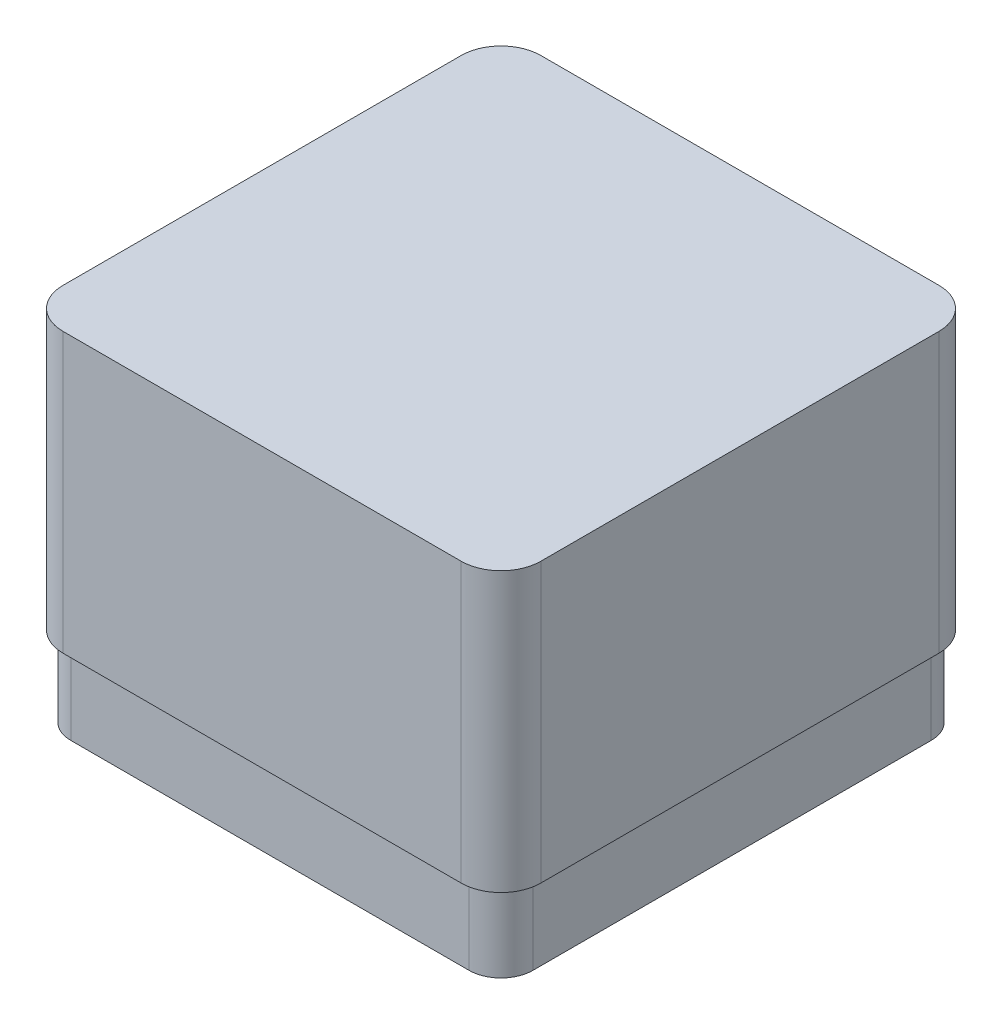
ISO-10303-21;
HEADER;
FILE_DESCRIPTION(('STEP AP214'),'2;1');
FILE_NAME('part.step','',(''),(''),'','','');
FILE_SCHEMA(('AUTOMOTIVE_DESIGN { 1 0 10303 214 1 1 1 1 }'));
ENDSEC;
DATA;
#1=APPLICATION_CONTEXT('core data for automotive mechanical design processes');
#2=APPLICATION_PROTOCOL_DEFINITION('international standard','automotive_design',2000,#1);
#3=PRODUCT_CONTEXT('',#1,'mechanical');
#4=PRODUCT('Part','Part','',(#3));
#5=PRODUCT_RELATED_PRODUCT_CATEGORY('part','',(#4));
#6=PRODUCT_DEFINITION_FORMATION('','',#4);
#7=PRODUCT_DEFINITION_CONTEXT('part definition',#1,'design');
#8=PRODUCT_DEFINITION('design','',#6,#7);
#9=PRODUCT_DEFINITION_SHAPE('','',#8);
#10=(LENGTH_UNIT() NAMED_UNIT(*) SI_UNIT(.MILLI.,.METRE.));
#11=(NAMED_UNIT(*) PLANE_ANGLE_UNIT() SI_UNIT($,.RADIAN.));
#12=(NAMED_UNIT(*) SI_UNIT($,.STERADIAN.) SOLID_ANGLE_UNIT());
#13=UNCERTAINTY_MEASURE_WITH_UNIT(LENGTH_MEASURE(1.E-05),#10,'distance_accuracy_value','');
#14=(GEOMETRIC_REPRESENTATION_CONTEXT(3) GLOBAL_UNCERTAINTY_ASSIGNED_CONTEXT((#13)) GLOBAL_UNIT_ASSIGNED_CONTEXT((#10,
#11,#12)) REPRESENTATION_CONTEXT('',''));
#15=CARTESIAN_POINT('',(0.,0.,0.));
#16=DIRECTION('',(0.,0.,1.));
#17=DIRECTION('',(1.,0.,0.));
#18=AXIS2_PLACEMENT_3D('',#15,#16,#17);
#19=CARTESIAN_POINT('',(0.,0.,0.));
#20=DIRECTION('',(0.,-1.,0.));
#21=DIRECTION('',(0.,0.,-1.));
#22=AXIS2_PLACEMENT_3D('',#19,#20,#21);
#23=PLANE('',#22);
#24=CARTESIAN_POINT('',(110.,0.,-10.));
#25=DIRECTION('',(0.,-1.,0.));
#26=DIRECTION('',(0.,0.,-1.));
#27=AXIS2_PLACEMENT_3D('',#24,#25,#26);
#28=CIRCLE('',#27,6.);
#29=CARTESIAN_POINT('',(116.,0.,-10.));
#30=VERTEX_POINT('',#29);
#31=CARTESIAN_POINT('',(110.,0.,-4.));
#32=VERTEX_POINT('',#31);
#33=EDGE_CURVE('E315',#30,#32,#28,.T.);
#34=ORIENTED_EDGE('',*,*,#33,.F.);
#35=DIRECTION('',(0.,0.,-1.));
#36=VECTOR('',#35,1.);
#37=CARTESIAN_POINT('',(116.,0.,0.));
#38=LINE('',#37,#36);
#39=CARTESIAN_POINT('',(116.,0.,-110.));
#40=VERTEX_POINT('',#39);
#41=EDGE_CURVE('E333',#30,#40,#38,.T.);
#42=ORIENTED_EDGE('',*,*,#41,.T.);
#43=CARTESIAN_POINT('',(110.,0.,-110.));
#44=DIRECTION('',(0.,-1.,0.));
#45=DIRECTION('',(0.,0.,-1.));
#46=AXIS2_PLACEMENT_3D('',#43,#44,#45);
#47=CIRCLE('',#46,6.);
#48=CARTESIAN_POINT('',(110.,0.,-116.));
#49=VERTEX_POINT('',#48);
#50=EDGE_CURVE('E318',#49,#40,#47,.T.);
#51=ORIENTED_EDGE('',*,*,#50,.F.);
#52=DIRECTION('',(-1.,0.,0.));
#53=VECTOR('',#52,1.);
#54=CARTESIAN_POINT('',(0.,0.,-116.));
#55=LINE('',#54,#53);
#56=CARTESIAN_POINT('',(9.99999999999997,0.,-116.));
#57=VERTEX_POINT('',#56);
#58=EDGE_CURVE('E292',#49,#57,#55,.T.);
#59=ORIENTED_EDGE('',*,*,#58,.T.);
#60=CARTESIAN_POINT('',(9.99999999999997,0.,-110.));
#61=DIRECTION('',(0.,-1.,0.));
#62=DIRECTION('',(0.,0.,-1.));
#63=AXIS2_PLACEMENT_3D('',#60,#61,#62);
#64=CIRCLE('',#63,6.);
#65=CARTESIAN_POINT('',(3.99999999999997,0.,-110.));
#66=VERTEX_POINT('',#65);
#67=EDGE_CURVE('E328',#66,#57,#64,.T.);
#68=ORIENTED_EDGE('',*,*,#67,.F.);
#69=DIRECTION('',(0.,0.,1.));
#70=VECTOR('',#69,1.);
#71=CARTESIAN_POINT('',(4.,0.,0.));
#72=LINE('',#71,#70);
#73=CARTESIAN_POINT('',(4.,0.,-10.));
#74=VERTEX_POINT('',#73);
#75=EDGE_CURVE('E283',#66,#74,#72,.T.);
#76=ORIENTED_EDGE('',*,*,#75,.T.);
#77=CARTESIAN_POINT('',(9.99999999999999,0.,-10.));
#78=DIRECTION('',(0.,-1.,0.));
#79=DIRECTION('',(0.,0.,-1.));
#80=AXIS2_PLACEMENT_3D('',#77,#78,#79);
#81=CIRCLE('',#80,6.);
#82=CARTESIAN_POINT('',(9.99999999999999,0.,-4.));
#83=VERTEX_POINT('',#82);
#84=EDGE_CURVE('E330',#83,#74,#81,.T.);
#85=ORIENTED_EDGE('',*,*,#84,.F.);
#86=DIRECTION('',(1.,0.,0.));
#87=VECTOR('',#86,1.);
#88=CARTESIAN_POINT('',(0.,0.,-4.));
#89=LINE('',#88,#87);
#90=EDGE_CURVE('E327',#83,#32,#89,.T.);
#91=ORIENTED_EDGE('',*,*,#90,.T.);
#92=EDGE_LOOP('',(#34,#42,#51,#59,#68,#76,#85,#91));
#93=FACE_BOUND('',#92,.T.);
#94=DIRECTION('',(1.,0.,0.));
#95=VECTOR('',#94,1.);
#96=CARTESIAN_POINT('',(9.99999999999997,0.,-118.));
#97=LINE('',#96,#95);
#98=CARTESIAN_POINT('',(9.99999999999997,0.,-118.));
#99=VERTEX_POINT('',#98);
#100=CARTESIAN_POINT('',(110.,0.,-118.));
#101=VERTEX_POINT('',#100);
#102=EDGE_CURVE('E221',#99,#101,#97,.T.);
#103=ORIENTED_EDGE('',*,*,#102,.T.);
#104=CARTESIAN_POINT('',(110.,0.,-110.));
#105=DIRECTION('',(0.,-1.,0.));
#106=DIRECTION('',(0.,0.,-1.));
#107=AXIS2_PLACEMENT_3D('',#104,#105,#106);
#108=CIRCLE('',#107,7.99999999999999);
#109=CARTESIAN_POINT('',(118.,0.,-110.));
#110=VERTEX_POINT('',#109);
#111=EDGE_CURVE('E241',#101,#110,#108,.T.);
#112=ORIENTED_EDGE('',*,*,#111,.T.);
#113=DIRECTION('',(0.,0.,1.));
#114=VECTOR('',#113,1.);
#115=CARTESIAN_POINT('',(118.,0.,-110.));
#116=LINE('',#115,#114);
#117=CARTESIAN_POINT('',(118.,0.,-9.99999999999999));
#118=VERTEX_POINT('',#117);
#119=EDGE_CURVE('E201',#110,#118,#116,.T.);
#120=ORIENTED_EDGE('',*,*,#119,.T.);
#121=CARTESIAN_POINT('',(110.,0.,-10.));
#122=DIRECTION('',(0.,-1.,0.));
#123=DIRECTION('',(0.,0.,-1.));
#124=AXIS2_PLACEMENT_3D('',#121,#122,#123);
#125=CIRCLE('',#124,7.99999999999998);
#126=CARTESIAN_POINT('',(110.,0.,-2.00000000000002));
#127=VERTEX_POINT('',#126);
#128=EDGE_CURVE('E50',#118,#127,#125,.T.);
#129=ORIENTED_EDGE('',*,*,#128,.T.);
#130=DIRECTION('',(-1.,0.,0.));
#131=VECTOR('',#130,1.);
#132=CARTESIAN_POINT('',(110.,0.,-2.));
#133=LINE('',#132,#131);
#134=CARTESIAN_POINT('',(9.99999999999999,0.,-2.));
#135=VERTEX_POINT('',#134);
#136=EDGE_CURVE('E245',#127,#135,#133,.T.);
#137=ORIENTED_EDGE('',*,*,#136,.T.);
#138=CARTESIAN_POINT('',(9.99999999999999,0.,-10.));
#139=DIRECTION('',(0.,-1.,0.));
#140=DIRECTION('',(0.,0.,-1.));
#141=AXIS2_PLACEMENT_3D('',#138,#139,#140);
#142=CIRCLE('',#141,8.);
#143=CARTESIAN_POINT('',(2.,0.,-10.));
#144=VERTEX_POINT('',#143);
#145=EDGE_CURVE('E248',#135,#144,#142,.T.);
#146=ORIENTED_EDGE('',*,*,#145,.T.);
#147=DIRECTION('',(0.,0.,-1.));
#148=VECTOR('',#147,1.);
#149=CARTESIAN_POINT('',(2.,0.,-10.));
#150=LINE('',#149,#148);
#151=CARTESIAN_POINT('',(2.,0.,-110.));
#152=VERTEX_POINT('',#151);
#153=EDGE_CURVE('E251',#144,#152,#150,.T.);
#154=ORIENTED_EDGE('',*,*,#153,.T.);
#155=CARTESIAN_POINT('',(9.99999999999997,0.,-110.));
#156=DIRECTION('',(0.,-1.,0.));
#157=DIRECTION('',(0.,0.,-1.));
#158=AXIS2_PLACEMENT_3D('',#155,#156,#157);
#159=CIRCLE('',#158,7.99999999999998);
#160=EDGE_CURVE('E224',#152,#99,#159,.T.);
#161=ORIENTED_EDGE('',*,*,#160,.T.);
#162=EDGE_LOOP('',(#103,#112,#120,#129,#137,#146,#154,#161));
#163=FACE_BOUND('',#162,.T.);
#164=ADVANCED_FACE('F35',(#93,#163),#23,.T.);
#165=CARTESIAN_POINT('',(4.,90.,0.));
#166=DIRECTION('',(1.,0.,0.));
#167=DIRECTION('',(0.,0.,-1.));
#168=AXIS2_PLACEMENT_3D('',#165,#166,#167);
#169=PLANE('',#168);
#170=ORIENTED_EDGE('',*,*,#75,.F.);
#171=DIRECTION('',(0.,1.,0.));
#172=VECTOR('',#171,1.);
#173=CARTESIAN_POINT('',(3.99999999999997,90.,-110.));
#174=LINE('',#173,#172);
#175=CARTESIAN_POINT('',(3.99999999999997,86.,-110.));
#176=VERTEX_POINT('',#175);
#177=EDGE_CURVE('E287',#176,#66,#174,.F.);
#178=ORIENTED_EDGE('',*,*,#177,.F.);
#179=DIRECTION('',(0.,0.,1.));
#180=VECTOR('',#179,1.);
#181=CARTESIAN_POINT('',(4.,86.,0.));
#182=LINE('',#181,#180);
#183=CARTESIAN_POINT('',(4.,86.,-10.));
#184=VERTEX_POINT('',#183);
#185=EDGE_CURVE('E288',#176,#184,#182,.T.);
#186=ORIENTED_EDGE('',*,*,#185,.T.);
#187=DIRECTION('',(0.,1.,0.));
#188=VECTOR('',#187,1.);
#189=CARTESIAN_POINT('',(4.,90.,-10.));
#190=LINE('',#189,#188);
#191=EDGE_CURVE('E284',#74,#184,#190,.T.);
#192=ORIENTED_EDGE('',*,*,#191,.F.);
#193=EDGE_LOOP('',(#170,#178,#186,#192));
#194=FACE_BOUND('',#193,.T.);
#195=ADVANCED_FACE('F427',(#194),#169,.T.);
#196=CARTESIAN_POINT('',(0.,90.,-4.));
#197=DIRECTION('',(0.,0.,-1.));
#198=DIRECTION('',(-1.,0.,0.));
#199=AXIS2_PLACEMENT_3D('',#196,#197,#198);
#200=PLANE('',#199);
#201=ORIENTED_EDGE('',*,*,#90,.F.);
#202=DIRECTION('',(0.,1.,0.));
#203=VECTOR('',#202,1.);
#204=CARTESIAN_POINT('',(9.99999999999999,90.,-4.));
#205=LINE('',#204,#203);
#206=CARTESIAN_POINT('',(9.99999999999999,86.,-4.));
#207=VERTEX_POINT('',#206);
#208=EDGE_CURVE('E313',#207,#83,#205,.F.);
#209=ORIENTED_EDGE('',*,*,#208,.F.);
#210=DIRECTION('',(1.,0.,0.));
#211=VECTOR('',#210,1.);
#212=CARTESIAN_POINT('',(0.,86.,-4.));
#213=LINE('',#212,#211);
#214=CARTESIAN_POINT('',(110.,86.,-4.));
#215=VERTEX_POINT('',#214);
#216=EDGE_CURVE('E291',#207,#215,#213,.T.);
#217=ORIENTED_EDGE('',*,*,#216,.T.);
#218=DIRECTION('',(0.,1.,0.));
#219=VECTOR('',#218,1.);
#220=CARTESIAN_POINT('',(110.,90.,-4.));
#221=LINE('',#220,#219);
#222=EDGE_CURVE('E306',#32,#215,#221,.T.);
#223=ORIENTED_EDGE('',*,*,#222,.F.);
#224=EDGE_LOOP('',(#201,#209,#217,#223));
#225=FACE_BOUND('',#224,.T.);
#226=ADVANCED_FACE('F433',(#225),#200,.T.);
#227=CARTESIAN_POINT('',(116.,90.,0.));
#228=DIRECTION('',(-1.,0.,0.));
#229=DIRECTION('',(0.,0.,1.));
#230=AXIS2_PLACEMENT_3D('',#227,#228,#229);
#231=PLANE('',#230);
#232=DIRECTION('',(0.,0.,-1.));
#233=VECTOR('',#232,1.);
#234=CARTESIAN_POINT('',(116.,86.,0.));
#235=LINE('',#234,#233);
#236=CARTESIAN_POINT('',(116.,86.,-10.));
#237=VERTEX_POINT('',#236);
#238=CARTESIAN_POINT('',(116.,86.,-110.));
#239=VERTEX_POINT('',#238);
#240=EDGE_CURVE('E297',#237,#239,#235,.T.);
#241=ORIENTED_EDGE('',*,*,#240,.T.);
#242=DIRECTION('',(0.,1.,0.));
#243=VECTOR('',#242,1.);
#244=CARTESIAN_POINT('',(116.,90.,-110.));
#245=LINE('',#244,#243);
#246=EDGE_CURVE('E309',#40,#239,#245,.T.);
#247=ORIENTED_EDGE('',*,*,#246,.F.);
#248=ORIENTED_EDGE('',*,*,#41,.F.);
#249=DIRECTION('',(0.,1.,0.));
#250=VECTOR('',#249,1.);
#251=CARTESIAN_POINT('',(116.,90.,-10.));
#252=LINE('',#251,#250);
#253=EDGE_CURVE('E316',#237,#30,#252,.F.);
#254=ORIENTED_EDGE('',*,*,#253,.F.);
#255=EDGE_LOOP('',(#241,#247,#248,#254));
#256=FACE_BOUND('',#255,.T.);
#257=ADVANCED_FACE('F620',(#256),#231,.T.);
#258=CARTESIAN_POINT('',(0.,90.,-116.));
#259=DIRECTION('',(0.,0.,1.));
#260=DIRECTION('',(1.,0.,0.));
#261=AXIS2_PLACEMENT_3D('',#258,#259,#260);
#262=PLANE('',#261);
#263=ORIENTED_EDGE('',*,*,#58,.F.);
#264=DIRECTION('',(0.,1.,0.));
#265=VECTOR('',#264,1.);
#266=CARTESIAN_POINT('',(110.,90.,-116.));
#267=LINE('',#266,#265);
#268=CARTESIAN_POINT('',(110.,86.,-116.));
#269=VERTEX_POINT('',#268);
#270=EDGE_CURVE('E286',#269,#49,#267,.F.);
#271=ORIENTED_EDGE('',*,*,#270,.F.);
#272=DIRECTION('',(-1.,0.,0.));
#273=VECTOR('',#272,1.);
#274=CARTESIAN_POINT('',(0.,86.,-116.));
#275=LINE('',#274,#273);
#276=CARTESIAN_POINT('',(9.99999999999997,86.,-116.));
#277=VERTEX_POINT('',#276);
#278=EDGE_CURVE('E302',#269,#277,#275,.T.);
#279=ORIENTED_EDGE('',*,*,#278,.T.);
#280=DIRECTION('',(0.,1.,0.));
#281=VECTOR('',#280,1.);
#282=CARTESIAN_POINT('',(9.99999999999997,90.,-116.));
#283=LINE('',#282,#281);
#284=EDGE_CURVE('E322',#57,#277,#283,.T.);
#285=ORIENTED_EDGE('',*,*,#284,.F.);
#286=EDGE_LOOP('',(#263,#271,#279,#285));
#287=FACE_BOUND('',#286,.T.);
#288=ADVANCED_FACE('F612',(#287),#262,.T.);
#289=CARTESIAN_POINT('',(0.,86.,0.));
#290=DIRECTION('',(0.,-1.,0.));
#291=DIRECTION('',(0.,0.,-1.));
#292=AXIS2_PLACEMENT_3D('',#289,#290,#291);
#293=PLANE('',#292);
#294=ORIENTED_EDGE('',*,*,#216,.F.);
#295=CARTESIAN_POINT('',(9.99999999999999,86.,-10.));
#296=DIRECTION('',(0.,-1.,0.));
#297=DIRECTION('',(0.,0.,-1.));
#298=AXIS2_PLACEMENT_3D('',#295,#296,#297);
#299=CIRCLE('',#298,6.);
#300=EDGE_CURVE('E299',#184,#207,#299,.F.);
#301=ORIENTED_EDGE('',*,*,#300,.F.);
#302=ORIENTED_EDGE('',*,*,#185,.F.);
#303=CARTESIAN_POINT('',(9.99999999999997,86.,-110.));
#304=DIRECTION('',(0.,-1.,0.));
#305=DIRECTION('',(0.,0.,-1.));
#306=AXIS2_PLACEMENT_3D('',#303,#304,#305);
#307=CIRCLE('',#306,6.);
#308=EDGE_CURVE('E305',#277,#176,#307,.F.);
#309=ORIENTED_EDGE('',*,*,#308,.F.);
#310=ORIENTED_EDGE('',*,*,#278,.F.);
#311=CARTESIAN_POINT('',(110.,86.,-110.));
#312=DIRECTION('',(0.,-1.,0.));
#313=DIRECTION('',(0.,0.,-1.));
#314=AXIS2_PLACEMENT_3D('',#311,#312,#313);
#315=CIRCLE('',#314,6.);
#316=EDGE_CURVE('E303',#239,#269,#315,.F.);
#317=ORIENTED_EDGE('',*,*,#316,.F.);
#318=ORIENTED_EDGE('',*,*,#240,.F.);
#319=CARTESIAN_POINT('',(110.,86.,-10.));
#320=DIRECTION('',(0.,-1.,0.));
#321=DIRECTION('',(0.,0.,-1.));
#322=AXIS2_PLACEMENT_3D('',#319,#320,#321);
#323=CIRCLE('',#322,6.);
#324=EDGE_CURVE('E294',#215,#237,#323,.F.);
#325=ORIENTED_EDGE('',*,*,#324,.F.);
#326=EDGE_LOOP('',(#294,#301,#302,#309,#310,#317,#318,#325));
#327=FACE_BOUND('',#326,.T.);
#328=ADVANCED_FACE('F604',(#327),#293,.T.);
#329=CARTESIAN_POINT('',(110.,90.,-10.));
#330=DIRECTION('',(0.,-1.,0.));
#331=DIRECTION('',(0.,0.,-1.));
#332=AXIS2_PLACEMENT_3D('',#329,#330,#331);
#333=CYLINDRICAL_SURFACE('',#332,6.);
#334=ORIENTED_EDGE('',*,*,#324,.T.);
#335=ORIENTED_EDGE('',*,*,#253,.T.);
#336=ORIENTED_EDGE('',*,*,#33,.T.);
#337=ORIENTED_EDGE('',*,*,#222,.T.);
#338=EDGE_LOOP('',(#334,#335,#336,#337));
#339=FACE_BOUND('',#338,.T.);
#340=ADVANCED_FACE('F596',(#339),#333,.F.);
#341=CARTESIAN_POINT('',(9.99999999999999,90.,-10.));
#342=DIRECTION('',(0.,-1.,0.));
#343=DIRECTION('',(0.,0.,-1.));
#344=AXIS2_PLACEMENT_3D('',#341,#342,#343);
#345=CYLINDRICAL_SURFACE('',#344,6.);
#346=ORIENTED_EDGE('',*,*,#300,.T.);
#347=ORIENTED_EDGE('',*,*,#208,.T.);
#348=ORIENTED_EDGE('',*,*,#84,.T.);
#349=ORIENTED_EDGE('',*,*,#191,.T.);
#350=EDGE_LOOP('',(#346,#347,#348,#349));
#351=FACE_BOUND('',#350,.T.);
#352=ADVANCED_FACE('F588',(#351),#345,.F.);
#353=CARTESIAN_POINT('',(9.99999999999997,90.,-110.));
#354=DIRECTION('',(0.,-1.,0.));
#355=DIRECTION('',(0.,0.,-1.));
#356=AXIS2_PLACEMENT_3D('',#353,#354,#355);
#357=CYLINDRICAL_SURFACE('',#356,6.);
#358=ORIENTED_EDGE('',*,*,#308,.T.);
#359=ORIENTED_EDGE('',*,*,#177,.T.);
#360=ORIENTED_EDGE('',*,*,#67,.T.);
#361=ORIENTED_EDGE('',*,*,#284,.T.);
#362=EDGE_LOOP('',(#358,#359,#360,#361));
#363=FACE_BOUND('',#362,.T.);
#364=ADVANCED_FACE('F582',(#363),#357,.F.);
#365=CARTESIAN_POINT('',(110.,90.,-110.));
#366=DIRECTION('',(0.,-1.,0.));
#367=DIRECTION('',(0.,0.,-1.));
#368=AXIS2_PLACEMENT_3D('',#365,#366,#367);
#369=CYLINDRICAL_SURFACE('',#368,6.);
#370=ORIENTED_EDGE('',*,*,#316,.T.);
#371=ORIENTED_EDGE('',*,*,#270,.T.);
#372=ORIENTED_EDGE('',*,*,#50,.T.);
#373=ORIENTED_EDGE('',*,*,#246,.T.);
#374=EDGE_LOOP('',(#370,#371,#372,#373));
#375=FACE_BOUND('',#374,.T.);
#376=ADVANCED_FACE('F544',(#375),#369,.F.);
#377=CARTESIAN_POINT('',(110.,20.,-110.));
#378=DIRECTION('',(0.,-1.,0.));
#379=DIRECTION('',(0.,0.,-1.));
#380=AXIS2_PLACEMENT_3D('',#377,#378,#379);
#381=PLANE('',#380);
#382=DIRECTION('',(1.,0.,0.));
#383=VECTOR('',#382,1.);
#384=CARTESIAN_POINT('',(9.99999999999997,20.,-118.));
#385=LINE('',#384,#383);
#386=CARTESIAN_POINT('',(9.99999999999997,20.,-118.));
#387=VERTEX_POINT('',#386);
#388=CARTESIAN_POINT('',(110.,20.,-118.));
#389=VERTEX_POINT('',#388);
#390=EDGE_CURVE('E207',#387,#389,#385,.T.);
#391=ORIENTED_EDGE('',*,*,#390,.F.);
#392=CARTESIAN_POINT('',(9.99999999999997,20.,-110.));
#393=DIRECTION('',(0.,-1.,0.));
#394=DIRECTION('',(0.,0.,-1.));
#395=AXIS2_PLACEMENT_3D('',#392,#393,#394);
#396=CIRCLE('',#395,7.99999999999998);
#397=CARTESIAN_POINT('',(2.,20.,-110.));
#398=VERTEX_POINT('',#397);
#399=EDGE_CURVE('E237',#398,#387,#396,.T.);
#400=ORIENTED_EDGE('',*,*,#399,.F.);
#401=DIRECTION('',(0.,0.,-1.));
#402=VECTOR('',#401,1.);
#403=CARTESIAN_POINT('',(2.,20.,-10.));
#404=LINE('',#403,#402);
#405=CARTESIAN_POINT('',(2.,20.,-10.));
#406=VERTEX_POINT('',#405);
#407=EDGE_CURVE('E234',#406,#398,#404,.T.);
#408=ORIENTED_EDGE('',*,*,#407,.F.);
#409=CARTESIAN_POINT('',(9.99999999999999,20.,-10.));
#410=DIRECTION('',(0.,-1.,0.));
#411=DIRECTION('',(0.,0.,-1.));
#412=AXIS2_PLACEMENT_3D('',#409,#410,#411);
#413=CIRCLE('',#412,8.);
#414=CARTESIAN_POINT('',(9.99999999999999,20.,-2.));
#415=VERTEX_POINT('',#414);
#416=EDGE_CURVE('E231',#415,#406,#413,.T.);
#417=ORIENTED_EDGE('',*,*,#416,.F.);
#418=DIRECTION('',(-1.,0.,0.));
#419=VECTOR('',#418,1.);
#420=CARTESIAN_POINT('',(110.,20.,-2.));
#421=LINE('',#420,#419);
#422=CARTESIAN_POINT('',(110.,20.,-2.00000000000002));
#423=VERTEX_POINT('',#422);
#424=EDGE_CURVE('E228',#423,#415,#421,.T.);
#425=ORIENTED_EDGE('',*,*,#424,.F.);
#426=CARTESIAN_POINT('',(110.,20.,-10.));
#427=DIRECTION('',(0.,-1.,0.));
#428=DIRECTION('',(0.,0.,-1.));
#429=AXIS2_PLACEMENT_3D('',#426,#427,#428);
#430=CIRCLE('',#429,7.99999999999998);
#431=CARTESIAN_POINT('',(118.,20.,-9.99999999999999));
#432=VERTEX_POINT('',#431);
#433=EDGE_CURVE('E217',#432,#423,#430,.T.);
#434=ORIENTED_EDGE('',*,*,#433,.F.);
#435=DIRECTION('',(0.,0.,1.));
#436=VECTOR('',#435,1.);
#437=CARTESIAN_POINT('',(118.,20.,-110.));
#438=LINE('',#437,#436);
#439=CARTESIAN_POINT('',(118.,20.,-110.));
#440=VERTEX_POINT('',#439);
#441=EDGE_CURVE('E199',#440,#432,#438,.T.);
#442=ORIENTED_EDGE('',*,*,#441,.F.);
#443=CARTESIAN_POINT('',(110.,20.,-110.));
#444=DIRECTION('',(0.,-1.,0.));
#445=DIRECTION('',(0.,0.,-1.));
#446=AXIS2_PLACEMENT_3D('',#443,#444,#445);
#447=CIRCLE('',#446,7.99999999999999);
#448=EDGE_CURVE('E213',#389,#440,#447,.T.);
#449=ORIENTED_EDGE('',*,*,#448,.F.);
#450=EDGE_LOOP('',(#391,#400,#408,#417,#425,#434,#442,#449));
#451=FACE_BOUND('',#450,.T.);
#452=CARTESIAN_POINT('',(110.,20.,-110.));
#453=DIRECTION('',(0.,-1.,0.));
#454=DIRECTION('',(0.,0.,-1.));
#455=AXIS2_PLACEMENT_3D('',#452,#453,#454);
#456=CIRCLE('',#455,9.99999999999999);
#457=CARTESIAN_POINT('',(110.,20.,-120.));
#458=VERTEX_POINT('',#457);
#459=CARTESIAN_POINT('',(120.,20.,-110.));
#460=VERTEX_POINT('',#459);
#461=EDGE_CURVE('E257',#458,#460,#456,.T.);
#462=ORIENTED_EDGE('',*,*,#461,.T.);
#463=DIRECTION('',(0.,0.,1.));
#464=VECTOR('',#463,1.);
#465=CARTESIAN_POINT('',(120.,20.,-110.));
#466=LINE('',#465,#464);
#467=CARTESIAN_POINT('',(120.,20.,-10.));
#468=VERTEX_POINT('',#467);
#469=EDGE_CURVE('E270',#460,#468,#466,.T.);
#470=ORIENTED_EDGE('',*,*,#469,.T.);
#471=CARTESIAN_POINT('',(110.,20.,-10.));
#472=DIRECTION('',(0.,-1.,0.));
#473=DIRECTION('',(0.,0.,-1.));
#474=AXIS2_PLACEMENT_3D('',#471,#472,#473);
#475=CIRCLE('',#474,9.99999999999999);
#476=CARTESIAN_POINT('',(110.,20.,0.));
#477=VERTEX_POINT('',#476);
#478=EDGE_CURVE('E272',#468,#477,#475,.T.);
#479=ORIENTED_EDGE('',*,*,#478,.T.);
#480=DIRECTION('',(-1.,0.,0.));
#481=VECTOR('',#480,1.);
#482=CARTESIAN_POINT('',(110.,20.,0.));
#483=LINE('',#482,#481);
#484=CARTESIAN_POINT('',(9.99999999999999,20.,0.));
#485=VERTEX_POINT('',#484);
#486=EDGE_CURVE('E274',#477,#485,#483,.T.);
#487=ORIENTED_EDGE('',*,*,#486,.T.);
#488=CARTESIAN_POINT('',(9.99999999999999,20.,-10.));
#489=DIRECTION('',(0.,-1.,0.));
#490=DIRECTION('',(0.,0.,-1.));
#491=AXIS2_PLACEMENT_3D('',#488,#489,#490);
#492=CIRCLE('',#491,10.);
#493=CARTESIAN_POINT('',(0.,20.,-10.));
#494=VERTEX_POINT('',#493);
#495=EDGE_CURVE('E276',#485,#494,#492,.T.);
#496=ORIENTED_EDGE('',*,*,#495,.T.);
#497=DIRECTION('',(0.,0.,-1.));
#498=VECTOR('',#497,1.);
#499=CARTESIAN_POINT('',(0.,20.,-10.));
#500=LINE('',#499,#498);
#501=CARTESIAN_POINT('',(0.,20.,-110.));
#502=VERTEX_POINT('',#501);
#503=EDGE_CURVE('E278',#494,#502,#500,.T.);
#504=ORIENTED_EDGE('',*,*,#503,.T.);
#505=CARTESIAN_POINT('',(9.99999999999997,20.,-110.));
#506=DIRECTION('',(0.,-1.,0.));
#507=DIRECTION('',(0.,0.,-1.));
#508=AXIS2_PLACEMENT_3D('',#505,#506,#507);
#509=CIRCLE('',#508,10.);
#510=CARTESIAN_POINT('',(9.99999999999997,20.,-120.));
#511=VERTEX_POINT('',#510);
#512=EDGE_CURVE('E280',#502,#511,#509,.T.);
#513=ORIENTED_EDGE('',*,*,#512,.T.);
#514=DIRECTION('',(1.,0.,0.));
#515=VECTOR('',#514,1.);
#516=CARTESIAN_POINT('',(9.99999999999997,20.,-120.));
#517=LINE('',#516,#515);
#518=EDGE_CURVE('E58',#511,#458,#517,.T.);
#519=ORIENTED_EDGE('',*,*,#518,.T.);
#520=EDGE_LOOP('',(#462,#470,#479,#487,#496,#504,#513,#519));
#521=FACE_BOUND('',#520,.T.);
#522=ADVANCED_FACE('F212',(#451,#521),#381,.T.);
#523=CARTESIAN_POINT('',(110.,20.,-110.));
#524=DIRECTION('',(0.,-1.,0.));
#525=DIRECTION('',(0.,0.,-1.));
#526=AXIS2_PLACEMENT_3D('',#523,#524,#525);
#527=CYLINDRICAL_SURFACE('',#526,7.99999999999999);
#528=ORIENTED_EDGE('',*,*,#111,.F.);
#529=DIRECTION('',(0.,-1.,0.));
#530=VECTOR('',#529,1.);
#531=CARTESIAN_POINT('',(110.,20.,-118.));
#532=LINE('',#531,#530);
#533=EDGE_CURVE('E220',#389,#101,#532,.T.);
#534=ORIENTED_EDGE('',*,*,#533,.F.);
#535=ORIENTED_EDGE('',*,*,#448,.T.);
#536=DIRECTION('',(0.,-1.,0.));
#537=VECTOR('',#536,1.);
#538=CARTESIAN_POINT('',(118.,20.,-110.));
#539=LINE('',#538,#537);
#540=EDGE_CURVE('E196',#440,#110,#539,.T.);
#541=ORIENTED_EDGE('',*,*,#540,.T.);
#542=EDGE_LOOP('',(#528,#534,#535,#541));
#543=FACE_BOUND('',#542,.T.);
#544=ADVANCED_FACE('F219',(#543),#527,.T.);
#545=CARTESIAN_POINT('',(9.99999999999997,20.,-118.));
#546=DIRECTION('',(0.,0.,-1.));
#547=DIRECTION('',(-1.,0.,0.));
#548=AXIS2_PLACEMENT_3D('',#545,#546,#547);
#549=PLANE('',#548);
#550=ORIENTED_EDGE('',*,*,#102,.F.);
#551=DIRECTION('',(0.,-1.,0.));
#552=VECTOR('',#551,1.);
#553=CARTESIAN_POINT('',(9.99999999999997,20.,-118.));
#554=LINE('',#553,#552);
#555=EDGE_CURVE('E258',#387,#99,#554,.T.);
#556=ORIENTED_EDGE('',*,*,#555,.F.);
#557=ORIENTED_EDGE('',*,*,#390,.T.);
#558=ORIENTED_EDGE('',*,*,#533,.T.);
#559=EDGE_LOOP('',(#550,#556,#557,#558));
#560=FACE_BOUND('',#559,.T.);
#561=ADVANCED_FACE('F519',(#560),#549,.T.);
#562=CARTESIAN_POINT('',(9.99999999999997,20.,-110.));
#563=DIRECTION('',(0.,-1.,0.));
#564=DIRECTION('',(0.,0.,-1.));
#565=AXIS2_PLACEMENT_3D('',#562,#563,#564);
#566=CYLINDRICAL_SURFACE('',#565,7.99999999999998);
#567=ORIENTED_EDGE('',*,*,#160,.F.);
#568=DIRECTION('',(0.,-1.,0.));
#569=VECTOR('',#568,1.);
#570=CARTESIAN_POINT('',(2.,20.,-110.));
#571=LINE('',#570,#569);
#572=EDGE_CURVE('E260',#398,#152,#571,.T.);
#573=ORIENTED_EDGE('',*,*,#572,.F.);
#574=ORIENTED_EDGE('',*,*,#399,.T.);
#575=ORIENTED_EDGE('',*,*,#555,.T.);
#576=EDGE_LOOP('',(#567,#573,#574,#575));
#577=FACE_BOUND('',#576,.T.);
#578=ADVANCED_FACE('F509',(#577),#566,.T.);
#579=CARTESIAN_POINT('',(2.,20.,-10.));
#580=DIRECTION('',(-1.,0.,0.));
#581=DIRECTION('',(0.,0.,1.));
#582=AXIS2_PLACEMENT_3D('',#579,#580,#581);
#583=PLANE('',#582);
#584=ORIENTED_EDGE('',*,*,#153,.F.);
#585=DIRECTION('',(0.,-1.,0.));
#586=VECTOR('',#585,1.);
#587=CARTESIAN_POINT('',(2.,20.,-10.));
#588=LINE('',#587,#586);
#589=EDGE_CURVE('E262',#406,#144,#588,.T.);
#590=ORIENTED_EDGE('',*,*,#589,.F.);
#591=ORIENTED_EDGE('',*,*,#407,.T.);
#592=ORIENTED_EDGE('',*,*,#572,.T.);
#593=EDGE_LOOP('',(#584,#590,#591,#592));
#594=FACE_BOUND('',#593,.T.);
#595=ADVANCED_FACE('F499',(#594),#583,.T.);
#596=CARTESIAN_POINT('',(9.99999999999999,20.,-10.));
#597=DIRECTION('',(0.,-1.,0.));
#598=DIRECTION('',(0.,0.,-1.));
#599=AXIS2_PLACEMENT_3D('',#596,#597,#598);
#600=CYLINDRICAL_SURFACE('',#599,8.);
#601=ORIENTED_EDGE('',*,*,#145,.F.);
#602=DIRECTION('',(0.,-1.,0.));
#603=VECTOR('',#602,1.);
#604=CARTESIAN_POINT('',(9.99999999999999,20.,-2.));
#605=LINE('',#604,#603);
#606=EDGE_CURVE('E264',#415,#135,#605,.T.);
#607=ORIENTED_EDGE('',*,*,#606,.F.);
#608=ORIENTED_EDGE('',*,*,#416,.T.);
#609=ORIENTED_EDGE('',*,*,#589,.T.);
#610=EDGE_LOOP('',(#601,#607,#608,#609));
#611=FACE_BOUND('',#610,.T.);
#612=ADVANCED_FACE('F489',(#611),#600,.T.);
#613=CARTESIAN_POINT('',(110.,20.,-2.));
#614=DIRECTION('',(0.,0.,1.));
#615=DIRECTION('',(1.,0.,0.));
#616=AXIS2_PLACEMENT_3D('',#613,#614,#615);
#617=PLANE('',#616);
#618=ORIENTED_EDGE('',*,*,#136,.F.);
#619=DIRECTION('',(0.,-1.,0.));
#620=VECTOR('',#619,1.);
#621=CARTESIAN_POINT('',(110.,20.,-2.00000000000002));
#622=LINE('',#621,#620);
#623=EDGE_CURVE('E266',#423,#127,#622,.T.);
#624=ORIENTED_EDGE('',*,*,#623,.F.);
#625=ORIENTED_EDGE('',*,*,#424,.T.);
#626=ORIENTED_EDGE('',*,*,#606,.T.);
#627=EDGE_LOOP('',(#618,#624,#625,#626));
#628=FACE_BOUND('',#627,.T.);
#629=ADVANCED_FACE('F480',(#628),#617,.T.);
#630=CARTESIAN_POINT('',(110.,20.,-10.));
#631=DIRECTION('',(0.,-1.,0.));
#632=DIRECTION('',(0.,0.,-1.));
#633=AXIS2_PLACEMENT_3D('',#630,#631,#632);
#634=CYLINDRICAL_SURFACE('',#633,7.99999999999998);
#635=ORIENTED_EDGE('',*,*,#128,.F.);
#636=DIRECTION('',(0.,-1.,0.));
#637=VECTOR('',#636,1.);
#638=CARTESIAN_POINT('',(118.,20.,-9.99999999999999));
#639=LINE('',#638,#637);
#640=EDGE_CURVE('E206',#432,#118,#639,.T.);
#641=ORIENTED_EDGE('',*,*,#640,.F.);
#642=ORIENTED_EDGE('',*,*,#433,.T.);
#643=ORIENTED_EDGE('',*,*,#623,.T.);
#644=EDGE_LOOP('',(#635,#641,#642,#643));
#645=FACE_BOUND('',#644,.T.);
#646=ADVANCED_FACE('F422',(#645),#634,.T.);
#647=CARTESIAN_POINT('',(118.,20.,-110.));
#648=DIRECTION('',(1.,0.,0.));
#649=DIRECTION('',(0.,0.,-1.));
#650=AXIS2_PLACEMENT_3D('',#647,#648,#649);
#651=PLANE('',#650);
#652=ORIENTED_EDGE('',*,*,#119,.F.);
#653=ORIENTED_EDGE('',*,*,#540,.F.);
#654=ORIENTED_EDGE('',*,*,#441,.T.);
#655=ORIENTED_EDGE('',*,*,#640,.T.);
#656=EDGE_LOOP('',(#652,#653,#654,#655));
#657=FACE_BOUND('',#656,.T.);
#658=ADVANCED_FACE('F198',(#657),#651,.T.);
#659=CARTESIAN_POINT('',(0.,90.,0.));
#660=DIRECTION('',(0.,-1.,0.));
#661=DIRECTION('',(0.,0.,-1.));
#662=AXIS2_PLACEMENT_3D('',#659,#660,#661);
#663=PLANE('',#662);
#664=DIRECTION('',(1.,0.,0.));
#665=VECTOR('',#664,1.);
#666=CARTESIAN_POINT('',(0.,90.,0.));
#667=LINE('',#666,#665);
#668=CARTESIAN_POINT('',(9.99999999999999,90.,0.));
#669=VERTEX_POINT('',#668);
#670=CARTESIAN_POINT('',(110.,90.,0.));
#671=VERTEX_POINT('',#670);
#672=EDGE_CURVE('E343',#669,#671,#667,.T.);
#673=ORIENTED_EDGE('',*,*,#672,.T.);
#674=CARTESIAN_POINT('',(110.,90.,-10.));
#675=DIRECTION('',(0.,-1.,0.));
#676=DIRECTION('',(0.,0.,-1.));
#677=AXIS2_PLACEMENT_3D('',#674,#675,#676);
#678=CIRCLE('',#677,10.);
#679=CARTESIAN_POINT('',(120.,90.,-10.));
#680=VERTEX_POINT('',#679);
#681=EDGE_CURVE('E368',#671,#680,#678,.F.);
#682=ORIENTED_EDGE('',*,*,#681,.T.);
#683=DIRECTION('',(0.,0.,-1.));
#684=VECTOR('',#683,1.);
#685=CARTESIAN_POINT('',(120.,90.,0.));
#686=LINE('',#685,#684);
#687=CARTESIAN_POINT('',(120.,90.,-110.));
#688=VERTEX_POINT('',#687);
#689=EDGE_CURVE('E346',#680,#688,#686,.T.);
#690=ORIENTED_EDGE('',*,*,#689,.T.);
#691=CARTESIAN_POINT('',(110.,90.,-110.));
#692=DIRECTION('',(0.,-1.,0.));
#693=DIRECTION('',(0.,0.,-1.));
#694=AXIS2_PLACEMENT_3D('',#691,#692,#693);
#695=CIRCLE('',#694,10.);
#696=CARTESIAN_POINT('',(110.,90.,-120.));
#697=VERTEX_POINT('',#696);
#698=EDGE_CURVE('E362',#688,#697,#695,.F.);
#699=ORIENTED_EDGE('',*,*,#698,.T.);
#700=DIRECTION('',(-1.,0.,0.));
#701=VECTOR('',#700,1.);
#702=CARTESIAN_POINT('',(0.,90.,-120.));
#703=LINE('',#702,#701);
#704=CARTESIAN_POINT('',(9.99999999999997,90.,-120.));
#705=VERTEX_POINT('',#704);
#706=EDGE_CURVE('E349',#697,#705,#703,.T.);
#707=ORIENTED_EDGE('',*,*,#706,.T.);
#708=CARTESIAN_POINT('',(9.99999999999997,90.,-110.));
#709=DIRECTION('',(0.,-1.,0.));
#710=DIRECTION('',(0.,0.,-1.));
#711=AXIS2_PLACEMENT_3D('',#708,#709,#710);
#712=CIRCLE('',#711,10.);
#713=CARTESIAN_POINT('',(0.,90.,-110.));
#714=VERTEX_POINT('',#713);
#715=EDGE_CURVE('E364',#705,#714,#712,.F.);
#716=ORIENTED_EDGE('',*,*,#715,.T.);
#717=DIRECTION('',(0.,0.,1.));
#718=VECTOR('',#717,1.);
#719=CARTESIAN_POINT('',(0.,90.,0.));
#720=LINE('',#719,#718);
#721=CARTESIAN_POINT('',(0.,90.,-10.));
#722=VERTEX_POINT('',#721);
#723=EDGE_CURVE('E324',#714,#722,#720,.T.);
#724=ORIENTED_EDGE('',*,*,#723,.T.);
#725=CARTESIAN_POINT('',(9.99999999999999,90.,-10.));
#726=DIRECTION('',(0.,-1.,0.));
#727=DIRECTION('',(0.,0.,-1.));
#728=AXIS2_PLACEMENT_3D('',#725,#726,#727);
#729=CIRCLE('',#728,10.);
#730=EDGE_CURVE('E366',#722,#669,#729,.F.);
#731=ORIENTED_EDGE('',*,*,#730,.T.);
#732=EDGE_LOOP('',(#673,#682,#690,#699,#707,#716,#724,#731));
#733=FACE_BOUND('',#732,.T.);
#734=ADVANCED_FACE('F413',(#733),#663,.F.);
#735=CARTESIAN_POINT('',(9.99999999999999,90.,-10.));
#736=DIRECTION('',(0.,-1.,0.));
#737=DIRECTION('',(0.,0.,-1.));
#738=AXIS2_PLACEMENT_3D('',#735,#736,#737);
#739=CYLINDRICAL_SURFACE('',#738,10.);
#740=DIRECTION('',(0.,-1.,0.));
#741=VECTOR('',#740,1.);
#742=CARTESIAN_POINT('',(0.,90.,-10.));
#743=LINE('',#742,#741);
#744=EDGE_CURVE('E373',#494,#722,#743,.F.);
#745=ORIENTED_EDGE('',*,*,#744,.F.);
#746=ORIENTED_EDGE('',*,*,#495,.F.);
#747=DIRECTION('',(0.,-1.,0.));
#748=VECTOR('',#747,1.);
#749=CARTESIAN_POINT('',(9.99999999999999,90.,0.));
#750=LINE('',#749,#748);
#751=EDGE_CURVE('E357',#669,#485,#750,.T.);
#752=ORIENTED_EDGE('',*,*,#751,.F.);
#753=ORIENTED_EDGE('',*,*,#730,.F.);
#754=EDGE_LOOP('',(#745,#746,#752,#753));
#755=FACE_BOUND('',#754,.T.);
#756=ADVANCED_FACE('F402',(#755),#739,.T.);
#757=CARTESIAN_POINT('',(110.,90.,-10.));
#758=DIRECTION('',(0.,-1.,0.));
#759=DIRECTION('',(0.,0.,-1.));
#760=AXIS2_PLACEMENT_3D('',#757,#758,#759);
#761=CYLINDRICAL_SURFACE('',#760,10.);
#762=DIRECTION('',(0.,-1.,0.));
#763=VECTOR('',#762,1.);
#764=CARTESIAN_POINT('',(110.,90.,0.));
#765=LINE('',#764,#763);
#766=EDGE_CURVE('E360',#477,#671,#765,.F.);
#767=ORIENTED_EDGE('',*,*,#766,.F.);
#768=ORIENTED_EDGE('',*,*,#478,.F.);
#769=DIRECTION('',(0.,-1.,0.));
#770=VECTOR('',#769,1.);
#771=CARTESIAN_POINT('',(120.,90.,-10.));
#772=LINE('',#771,#770);
#773=EDGE_CURVE('E354',#680,#468,#772,.T.);
#774=ORIENTED_EDGE('',*,*,#773,.F.);
#775=ORIENTED_EDGE('',*,*,#681,.F.);
#776=EDGE_LOOP('',(#767,#768,#774,#775));
#777=FACE_BOUND('',#776,.T.);
#778=ADVANCED_FACE('F392',(#777),#761,.T.);
#779=CARTESIAN_POINT('',(110.,90.,-110.));
#780=DIRECTION('',(0.,-1.,0.));
#781=DIRECTION('',(0.,0.,-1.));
#782=AXIS2_PLACEMENT_3D('',#779,#780,#781);
#783=CYLINDRICAL_SURFACE('',#782,10.);
#784=DIRECTION('',(0.,-1.,0.));
#785=VECTOR('',#784,1.);
#786=CARTESIAN_POINT('',(120.,90.,-110.));
#787=LINE('',#786,#785);
#788=EDGE_CURVE('E352',#460,#688,#787,.F.);
#789=ORIENTED_EDGE('',*,*,#788,.F.);
#790=ORIENTED_EDGE('',*,*,#461,.F.);
#791=DIRECTION('',(0.,-1.,0.));
#792=VECTOR('',#791,1.);
#793=CARTESIAN_POINT('',(110.,90.,-120.));
#794=LINE('',#793,#792);
#795=EDGE_CURVE('E43',#697,#458,#794,.T.);
#796=ORIENTED_EDGE('',*,*,#795,.F.);
#797=ORIENTED_EDGE('',*,*,#698,.F.);
#798=EDGE_LOOP('',(#789,#790,#796,#797));
#799=FACE_BOUND('',#798,.T.);
#800=ADVANCED_FACE('F37',(#799),#783,.T.);
#801=CARTESIAN_POINT('',(9.99999999999997,90.,-110.));
#802=DIRECTION('',(0.,-1.,0.));
#803=DIRECTION('',(0.,0.,-1.));
#804=AXIS2_PLACEMENT_3D('',#801,#802,#803);
#805=CYLINDRICAL_SURFACE('',#804,10.);
#806=DIRECTION('',(0.,-1.,0.));
#807=VECTOR('',#806,1.);
#808=CARTESIAN_POINT('',(9.99999999999997,90.,-120.));
#809=LINE('',#808,#807);
#810=EDGE_CURVE('E11',#511,#705,#809,.F.);
#811=ORIENTED_EDGE('',*,*,#810,.F.);
#812=ORIENTED_EDGE('',*,*,#512,.F.);
#813=DIRECTION('',(0.,-1.,0.));
#814=VECTOR('',#813,1.);
#815=CARTESIAN_POINT('',(0.,90.,-110.));
#816=LINE('',#815,#814);
#817=EDGE_CURVE('E370',#714,#502,#816,.T.);
#818=ORIENTED_EDGE('',*,*,#817,.F.);
#819=ORIENTED_EDGE('',*,*,#715,.F.);
#820=EDGE_LOOP('',(#811,#812,#818,#819));
#821=FACE_BOUND('',#820,.T.);
#822=ADVANCED_FACE('F411',(#821),#805,.T.);
#823=CARTESIAN_POINT('',(0.,90.,-120.));
#824=DIRECTION('',(0.,0.,1.));
#825=DIRECTION('',(1.,0.,0.));
#826=AXIS2_PLACEMENT_3D('',#823,#824,#825);
#827=PLANE('',#826);
#828=ORIENTED_EDGE('',*,*,#518,.F.);
#829=ORIENTED_EDGE('',*,*,#810,.T.);
#830=ORIENTED_EDGE('',*,*,#706,.F.);
#831=ORIENTED_EDGE('',*,*,#795,.T.);
#832=EDGE_LOOP('',(#828,#829,#830,#831));
#833=FACE_BOUND('',#832,.T.);
#834=ADVANCED_FACE('F378',(#833),#827,.F.);
#835=CARTESIAN_POINT('',(120.,90.,0.));
#836=DIRECTION('',(-1.,0.,0.));
#837=DIRECTION('',(0.,0.,1.));
#838=AXIS2_PLACEMENT_3D('',#835,#836,#837);
#839=PLANE('',#838);
#840=ORIENTED_EDGE('',*,*,#469,.F.);
#841=ORIENTED_EDGE('',*,*,#788,.T.);
#842=ORIENTED_EDGE('',*,*,#689,.F.);
#843=ORIENTED_EDGE('',*,*,#773,.T.);
#844=EDGE_LOOP('',(#840,#841,#842,#843));
#845=FACE_BOUND('',#844,.T.);
#846=ADVANCED_FACE('F386',(#845),#839,.F.);
#847=CARTESIAN_POINT('',(0.,90.,0.));
#848=DIRECTION('',(0.,0.,-1.));
#849=DIRECTION('',(-1.,0.,0.));
#850=AXIS2_PLACEMENT_3D('',#847,#848,#849);
#851=PLANE('',#850);
#852=ORIENTED_EDGE('',*,*,#486,.F.);
#853=ORIENTED_EDGE('',*,*,#766,.T.);
#854=ORIENTED_EDGE('',*,*,#672,.F.);
#855=ORIENTED_EDGE('',*,*,#751,.T.);
#856=EDGE_LOOP('',(#852,#853,#854,#855));
#857=FACE_BOUND('',#856,.T.);
#858=ADVANCED_FACE('F396',(#857),#851,.F.);
#859=CARTESIAN_POINT('',(0.,90.,0.));
#860=DIRECTION('',(1.,0.,0.));
#861=DIRECTION('',(0.,0.,-1.));
#862=AXIS2_PLACEMENT_3D('',#859,#860,#861);
#863=PLANE('',#862);
#864=ORIENTED_EDGE('',*,*,#503,.F.);
#865=ORIENTED_EDGE('',*,*,#744,.T.);
#866=ORIENTED_EDGE('',*,*,#723,.F.);
#867=ORIENTED_EDGE('',*,*,#817,.T.);
#868=EDGE_LOOP('',(#864,#865,#866,#867));
#869=FACE_BOUND('',#868,.T.);
#870=ADVANCED_FACE('F406',(#869),#863,.F.);
#871=CLOSED_SHELL('',(#164,#195,#226,#257,#288,#328,#340,#352,#364,#376,#522,#544,#561,#578,
#595,#612,#629,#646,#658,#734,#756,#778,#800,#822,#834,#846,#858,#870));
#872=MANIFOLD_SOLID_BREP('B2',#871);
#873=ADVANCED_BREP_SHAPE_REPRESENTATION('',(#18,#872),#14);
#874=SHAPE_DEFINITION_REPRESENTATION(#9,#873);
ENDSEC;
END-ISO-10303-21;
